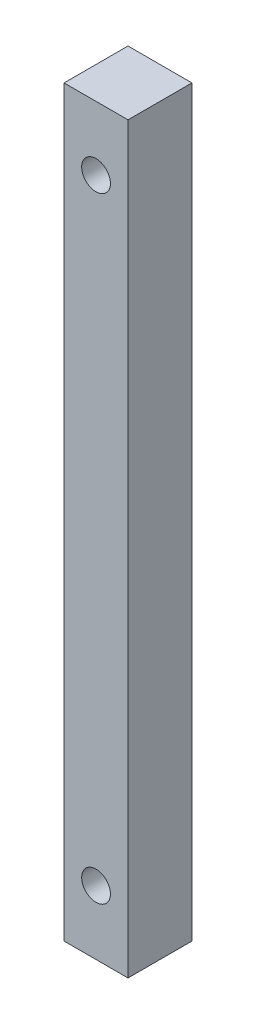
ISO-10303-21;
HEADER;
FILE_DESCRIPTION(('STEP AP214'),'2;1');
FILE_NAME('part.step','',(''),(''),'','','');
FILE_SCHEMA(('AUTOMOTIVE_DESIGN { 1 0 10303 214 1 1 1 1 }'));
ENDSEC;
DATA;
#1=APPLICATION_CONTEXT('core data for automotive mechanical design processes');
#2=APPLICATION_PROTOCOL_DEFINITION('international standard','automotive_design',2000,#1);
#3=PRODUCT_CONTEXT('',#1,'mechanical');
#4=PRODUCT('Part','Part','',(#3));
#5=PRODUCT_RELATED_PRODUCT_CATEGORY('part','',(#4));
#6=PRODUCT_DEFINITION_FORMATION('','',#4);
#7=PRODUCT_DEFINITION_CONTEXT('part definition',#1,'design');
#8=PRODUCT_DEFINITION('design','',#6,#7);
#9=PRODUCT_DEFINITION_SHAPE('','',#8);
#10=(LENGTH_UNIT() NAMED_UNIT(*) SI_UNIT(.MILLI.,.METRE.));
#11=(NAMED_UNIT(*) PLANE_ANGLE_UNIT() SI_UNIT($,.RADIAN.));
#12=(NAMED_UNIT(*) SI_UNIT($,.STERADIAN.) SOLID_ANGLE_UNIT());
#13=UNCERTAINTY_MEASURE_WITH_UNIT(LENGTH_MEASURE(1.E-05),#10,'distance_accuracy_value','');
#14=(GEOMETRIC_REPRESENTATION_CONTEXT(3) GLOBAL_UNCERTAINTY_ASSIGNED_CONTEXT((#13)) GLOBAL_UNIT_ASSIGNED_CONTEXT((#10,
#11,#12)) REPRESENTATION_CONTEXT('',''));
#15=CARTESIAN_POINT('',(0.,0.,0.));
#16=DIRECTION('',(0.,0.,1.));
#17=DIRECTION('',(1.,0.,0.));
#18=AXIS2_PLACEMENT_3D('',#15,#16,#17);
#19=CARTESIAN_POINT('',(0.,0.,5.08));
#20=DIRECTION('',(0.,0.,1.));
#21=DIRECTION('',(1.,0.,0.));
#22=AXIS2_PLACEMENT_3D('',#19,#20,#21);
#23=PLANE('',#22);
#24=CARTESIAN_POINT('',(2.54,-5.08,5.08));
#25=DIRECTION('',(0.,0.,1.));
#26=DIRECTION('',(1.,0.,0.));
#27=AXIS2_PLACEMENT_3D('',#24,#25,#26);
#28=CIRCLE('',#27,1.143);
#29=CARTESIAN_POINT('',(3.683,-5.08,5.08));
#30=VERTEX_POINT('',#29);
#31=EDGE_CURVE('E102',#30,#30,#28,.T.);
#32=ORIENTED_EDGE('',*,*,#31,.F.);
#33=EDGE_LOOP('',(#32));
#34=FACE_BOUND('',#33,.T.);
#35=DIRECTION('',(0.,-1.,0.));
#36=VECTOR('',#35,1.);
#37=CARTESIAN_POINT('',(0.,0.,5.08));
#38=LINE('',#37,#36);
#39=CARTESIAN_POINT('',(0.,0.,5.08));
#40=VERTEX_POINT('',#39);
#41=CARTESIAN_POINT('',(0.,-59.05498984,5.08));
#42=VERTEX_POINT('',#41);
#43=EDGE_CURVE('E87',#40,#42,#38,.T.);
#44=ORIENTED_EDGE('',*,*,#43,.T.);
#45=DIRECTION('',(1.,0.,0.));
#46=VECTOR('',#45,1.);
#47=CARTESIAN_POINT('',(0.,-59.05498984,5.08));
#48=LINE('',#47,#46);
#49=CARTESIAN_POINT('',(5.08000000000002,-59.05498984,5.08));
#50=VERTEX_POINT('',#49);
#51=EDGE_CURVE('E82',#42,#50,#48,.T.);
#52=ORIENTED_EDGE('',*,*,#51,.T.);
#53=DIRECTION('',(0.,1.,0.));
#54=VECTOR('',#53,1.);
#55=CARTESIAN_POINT('',(5.08,0.,5.08));
#56=LINE('',#55,#54);
#57=CARTESIAN_POINT('',(5.08,0.,5.08));
#58=VERTEX_POINT('',#57);
#59=EDGE_CURVE('E85',#50,#58,#56,.T.);
#60=ORIENTED_EDGE('',*,*,#59,.T.);
#61=DIRECTION('',(-1.,0.,0.));
#62=VECTOR('',#61,1.);
#63=CARTESIAN_POINT('',(0.,0.,5.08));
#64=LINE('',#63,#62);
#65=EDGE_CURVE('E52',#58,#40,#64,.T.);
#66=ORIENTED_EDGE('',*,*,#65,.T.);
#67=EDGE_LOOP('',(#44,#52,#60,#66));
#68=FACE_BOUND('',#67,.T.);
#69=CARTESIAN_POINT('',(2.54000000000002,-53.97498984,5.08));
#70=DIRECTION('',(0.,0.,1.));
#71=DIRECTION('',(1.,0.,0.));
#72=AXIS2_PLACEMENT_3D('',#69,#70,#71);
#73=CIRCLE('',#72,1.143);
#74=CARTESIAN_POINT('',(3.68300000000002,-53.97498984,5.08));
#75=VERTEX_POINT('',#74);
#76=EDGE_CURVE('E117',#75,#75,#73,.T.);
#77=ORIENTED_EDGE('',*,*,#76,.F.);
#78=EDGE_LOOP('',(#77));
#79=FACE_BOUND('',#78,.T.);
#80=ADVANCED_FACE('F35',(#34,#68,#79),#23,.T.);
#81=CARTESIAN_POINT('',(0.,0.,0.));
#82=DIRECTION('',(0.,0.,1.));
#83=DIRECTION('',(1.,0.,0.));
#84=AXIS2_PLACEMENT_3D('',#81,#82,#83);
#85=PLANE('',#84);
#86=DIRECTION('',(0.,-1.,0.));
#87=VECTOR('',#86,1.);
#88=CARTESIAN_POINT('',(0.,0.,0.));
#89=LINE('',#88,#87);
#90=CARTESIAN_POINT('',(0.,0.,0.));
#91=VERTEX_POINT('',#90);
#92=CARTESIAN_POINT('',(0.,-59.05498984,0.));
#93=VERTEX_POINT('',#92);
#94=EDGE_CURVE('E99',#91,#93,#89,.T.);
#95=ORIENTED_EDGE('',*,*,#94,.F.);
#96=DIRECTION('',(-1.,0.,0.));
#97=VECTOR('',#96,1.);
#98=CARTESIAN_POINT('',(0.,0.,0.));
#99=LINE('',#98,#97);
#100=CARTESIAN_POINT('',(5.08,0.,0.));
#101=VERTEX_POINT('',#100);
#102=EDGE_CURVE('E75',#101,#91,#99,.T.);
#103=ORIENTED_EDGE('',*,*,#102,.F.);
#104=DIRECTION('',(0.,1.,0.));
#105=VECTOR('',#104,1.);
#106=CARTESIAN_POINT('',(5.08,0.,0.));
#107=LINE('',#106,#105);
#108=CARTESIAN_POINT('',(5.08000000000002,-59.05498984,0.));
#109=VERTEX_POINT('',#108);
#110=EDGE_CURVE('E69',#109,#101,#107,.T.);
#111=ORIENTED_EDGE('',*,*,#110,.F.);
#112=DIRECTION('',(1.,0.,0.));
#113=VECTOR('',#112,1.);
#114=CARTESIAN_POINT('',(0.,-59.05498984,0.));
#115=LINE('',#114,#113);
#116=EDGE_CURVE('E91',#93,#109,#115,.T.);
#117=ORIENTED_EDGE('',*,*,#116,.F.);
#118=EDGE_LOOP('',(#95,#103,#111,#117));
#119=FACE_BOUND('',#118,.T.);
#120=CARTESIAN_POINT('',(2.54,-5.08,0.));
#121=DIRECTION('',(0.,0.,1.));
#122=DIRECTION('',(1.,0.,0.));
#123=AXIS2_PLACEMENT_3D('',#120,#121,#122);
#124=CIRCLE('',#123,1.143);
#125=CARTESIAN_POINT('',(3.683,-5.08,0.));
#126=VERTEX_POINT('',#125);
#127=EDGE_CURVE('E114',#126,#126,#124,.T.);
#128=ORIENTED_EDGE('',*,*,#127,.T.);
#129=EDGE_LOOP('',(#128));
#130=FACE_BOUND('',#129,.T.);
#131=CARTESIAN_POINT('',(2.54000000000002,-53.97498984,0.));
#132=DIRECTION('',(0.,0.,1.));
#133=DIRECTION('',(1.,0.,0.));
#134=AXIS2_PLACEMENT_3D('',#131,#132,#133);
#135=CIRCLE('',#134,1.143);
#136=CARTESIAN_POINT('',(3.68300000000002,-53.97498984,0.));
#137=VERTEX_POINT('',#136);
#138=EDGE_CURVE('E120',#137,#137,#135,.T.);
#139=ORIENTED_EDGE('',*,*,#138,.T.);
#140=EDGE_LOOP('',(#139));
#141=FACE_BOUND('',#140,.T.);
#142=ADVANCED_FACE('F110',(#119,#130,#141),#85,.F.);
#143=CARTESIAN_POINT('',(0.,0.,5.08));
#144=DIRECTION('',(1.,0.,0.));
#145=DIRECTION('',(0.,1.,0.));
#146=AXIS2_PLACEMENT_3D('',#143,#144,#145);
#147=PLANE('',#146);
#148=ORIENTED_EDGE('',*,*,#94,.T.);
#149=DIRECTION('',(0.,0.,-1.));
#150=VECTOR('',#149,1.);
#151=CARTESIAN_POINT('',(0.,-59.05498984,5.08));
#152=LINE('',#151,#150);
#153=EDGE_CURVE('E11',#42,#93,#152,.T.);
#154=ORIENTED_EDGE('',*,*,#153,.F.);
#155=ORIENTED_EDGE('',*,*,#43,.F.);
#156=DIRECTION('',(0.,0.,-1.));
#157=VECTOR('',#156,1.);
#158=CARTESIAN_POINT('',(0.,0.,5.08));
#159=LINE('',#158,#157);
#160=EDGE_CURVE('E95',#40,#91,#159,.T.);
#161=ORIENTED_EDGE('',*,*,#160,.T.);
#162=EDGE_LOOP('',(#148,#154,#155,#161));
#163=FACE_BOUND('',#162,.T.);
#164=ADVANCED_FACE('F37',(#163),#147,.F.);
#165=CARTESIAN_POINT('',(0.,-59.05498984,5.08));
#166=DIRECTION('',(0.,1.,0.));
#167=DIRECTION('',(0.,0.,1.));
#168=AXIS2_PLACEMENT_3D('',#165,#166,#167);
#169=PLANE('',#168);
#170=ORIENTED_EDGE('',*,*,#116,.T.);
#171=DIRECTION('',(0.,0.,-1.));
#172=VECTOR('',#171,1.);
#173=CARTESIAN_POINT('',(5.08000000000002,-59.05498984,5.08));
#174=LINE('',#173,#172);
#175=EDGE_CURVE('E44',#50,#109,#174,.T.);
#176=ORIENTED_EDGE('',*,*,#175,.F.);
#177=ORIENTED_EDGE('',*,*,#51,.F.);
#178=ORIENTED_EDGE('',*,*,#153,.T.);
#179=EDGE_LOOP('',(#170,#176,#177,#178));
#180=FACE_BOUND('',#179,.T.);
#181=ADVANCED_FACE('F90',(#180),#169,.F.);
#182=CARTESIAN_POINT('',(5.08,0.,5.08));
#183=DIRECTION('',(-1.,0.,0.));
#184=DIRECTION('',(0.,-1.,0.));
#185=AXIS2_PLACEMENT_3D('',#182,#183,#184);
#186=PLANE('',#185);
#187=ORIENTED_EDGE('',*,*,#110,.T.);
#188=DIRECTION('',(0.,0.,-1.));
#189=VECTOR('',#188,1.);
#190=CARTESIAN_POINT('',(5.08,0.,5.08));
#191=LINE('',#190,#189);
#192=EDGE_CURVE('E92',#58,#101,#191,.T.);
#193=ORIENTED_EDGE('',*,*,#192,.F.);
#194=ORIENTED_EDGE('',*,*,#59,.F.);
#195=ORIENTED_EDGE('',*,*,#175,.T.);
#196=EDGE_LOOP('',(#187,#193,#194,#195));
#197=FACE_BOUND('',#196,.T.);
#198=ADVANCED_FACE('F93',(#197),#186,.F.);
#199=CARTESIAN_POINT('',(0.,0.,5.08));
#200=DIRECTION('',(0.,-1.,0.));
#201=DIRECTION('',(0.,0.,-1.));
#202=AXIS2_PLACEMENT_3D('',#199,#200,#201);
#203=PLANE('',#202);
#204=ORIENTED_EDGE('',*,*,#102,.T.);
#205=ORIENTED_EDGE('',*,*,#160,.F.);
#206=ORIENTED_EDGE('',*,*,#65,.F.);
#207=ORIENTED_EDGE('',*,*,#192,.T.);
#208=EDGE_LOOP('',(#204,#205,#206,#207));
#209=FACE_BOUND('',#208,.T.);
#210=ADVANCED_FACE('F107',(#209),#203,.F.);
#211=CARTESIAN_POINT('',(2.54,-5.08,5.08));
#212=DIRECTION('',(0.,0.,-1.));
#213=DIRECTION('',(-1.,0.,0.));
#214=AXIS2_PLACEMENT_3D('',#211,#212,#213);
#215=CYLINDRICAL_SURFACE('',#214,1.143);
#216=ORIENTED_EDGE('',*,*,#31,.T.);
#217=EDGE_LOOP('',(#216));
#218=FACE_BOUND('',#217,.T.);
#219=ORIENTED_EDGE('',*,*,#127,.F.);
#220=EDGE_LOOP('',(#219));
#221=FACE_BOUND('',#220,.T.);
#222=ADVANCED_FACE('F137',(#218,#221),#215,.F.);
#223=CARTESIAN_POINT('',(2.54000000000002,-53.97498984,5.08));
#224=DIRECTION('',(0.,0.,-1.));
#225=DIRECTION('',(-1.,0.,0.));
#226=AXIS2_PLACEMENT_3D('',#223,#224,#225);
#227=CYLINDRICAL_SURFACE('',#226,1.143);
#228=ORIENTED_EDGE('',*,*,#76,.T.);
#229=EDGE_LOOP('',(#228));
#230=FACE_BOUND('',#229,.T.);
#231=ORIENTED_EDGE('',*,*,#138,.F.);
#232=EDGE_LOOP('',(#231));
#233=FACE_BOUND('',#232,.T.);
#234=ADVANCED_FACE('F126',(#230,#233),#227,.F.);
#235=CLOSED_SHELL('',(#80,#142,#164,#181,#198,#210,#222,#234));
#236=MANIFOLD_SOLID_BREP('B2',#235);
#237=ADVANCED_BREP_SHAPE_REPRESENTATION('',(#18,#236),#14);
#238=SHAPE_DEFINITION_REPRESENTATION(#9,#237);
ENDSEC;
END-ISO-10303-21;
